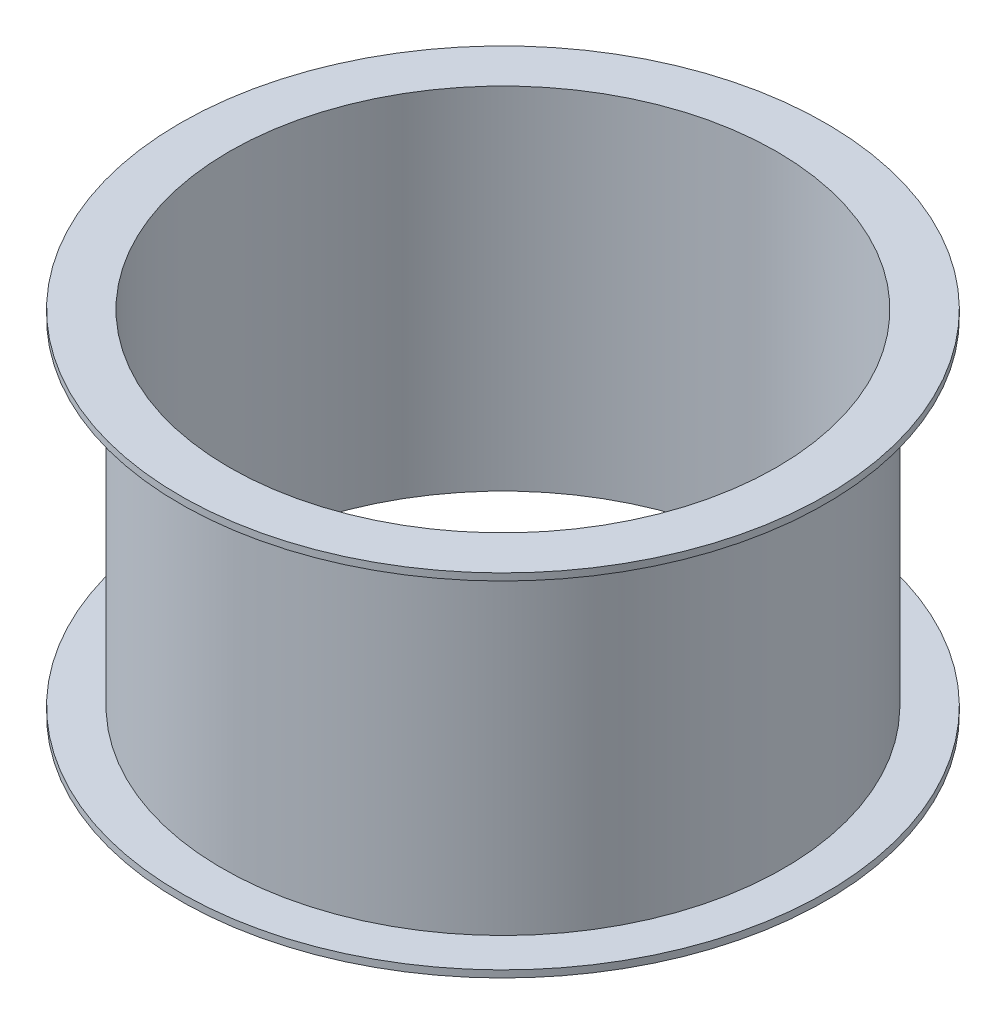
ISO-10303-21;
HEADER;
FILE_DESCRIPTION(('STEP AP214'),'2;1');
FILE_NAME('part.step','',(''),(''),'','','');
FILE_SCHEMA(('AUTOMOTIVE_DESIGN { 1 0 10303 214 1 1 1 1 }'));
ENDSEC;
DATA;
#1=APPLICATION_CONTEXT('core data for automotive mechanical design processes');
#2=APPLICATION_PROTOCOL_DEFINITION('international standard','automotive_design',2000,#1);
#3=PRODUCT_CONTEXT('',#1,'mechanical');
#4=PRODUCT('Part','Part','',(#3));
#5=PRODUCT_RELATED_PRODUCT_CATEGORY('part','',(#4));
#6=PRODUCT_DEFINITION_FORMATION('','',#4);
#7=PRODUCT_DEFINITION_CONTEXT('part definition',#1,'design');
#8=PRODUCT_DEFINITION('design','',#6,#7);
#9=PRODUCT_DEFINITION_SHAPE('','',#8);
#10=(LENGTH_UNIT() NAMED_UNIT(*) SI_UNIT(.MILLI.,.METRE.));
#11=(NAMED_UNIT(*) PLANE_ANGLE_UNIT() SI_UNIT($,.RADIAN.));
#12=(NAMED_UNIT(*) SI_UNIT($,.STERADIAN.) SOLID_ANGLE_UNIT());
#13=UNCERTAINTY_MEASURE_WITH_UNIT(LENGTH_MEASURE(1.E-05),#10,'distance_accuracy_value','');
#14=(GEOMETRIC_REPRESENTATION_CONTEXT(3) GLOBAL_UNCERTAINTY_ASSIGNED_CONTEXT((#13)) GLOBAL_UNIT_ASSIGNED_CONTEXT((#10,
#11,#12)) REPRESENTATION_CONTEXT('',''));
#15=CARTESIAN_POINT('',(0.,0.,0.));
#16=DIRECTION('',(0.,0.,1.));
#17=DIRECTION('',(1.,0.,0.));
#18=AXIS2_PLACEMENT_3D('',#15,#16,#17);
#19=CARTESIAN_POINT('',(-42.5,50.,0.));
#20=DIRECTION('',(0.,1.,0.));
#21=DIRECTION('',(1.,0.,0.));
#22=AXIS2_PLACEMENT_3D('',#19,#20,#21);
#23=PLANE('',#22);
#24=CARTESIAN_POINT('',(0.,50.,0.));
#25=DIRECTION('',(0.,1.,0.));
#26=DIRECTION('',(-1.,0.,0.));
#27=AXIS2_PLACEMENT_3D('',#24,#25,#26);
#28=CIRCLE('',#27,39.);
#29=CARTESIAN_POINT('',(-39.,50.,0.));
#30=VERTEX_POINT('',#29);
#31=EDGE_CURVE('E82',#30,#30,#28,.T.);
#32=ORIENTED_EDGE('',*,*,#31,.F.);
#33=EDGE_LOOP('',(#32));
#34=FACE_BOUND('',#33,.T.);
#35=CARTESIAN_POINT('',(0.,50.,0.));
#36=DIRECTION('',(0.,1.,0.));
#37=DIRECTION('',(-1.,0.,0.));
#38=AXIS2_PLACEMENT_3D('',#35,#36,#37);
#39=CIRCLE('',#38,46.);
#40=CARTESIAN_POINT('',(-46.,50.,0.));
#41=VERTEX_POINT('',#40);
#42=EDGE_CURVE('E10',#41,#41,#39,.T.);
#43=ORIENTED_EDGE('',*,*,#42,.T.);
#44=EDGE_LOOP('',(#43));
#45=FACE_BOUND('',#44,.T.);
#46=ADVANCED_FACE('F16',(#34,#45),#23,.T.);
#47=CARTESIAN_POINT('',(0.,49.5,0.));
#48=DIRECTION('',(0.,1.,0.));
#49=DIRECTION('',(-1.,0.,0.));
#50=AXIS2_PLACEMENT_3D('',#47,#48,#49);
#51=CYLINDRICAL_SURFACE('',#50,46.);
#52=CARTESIAN_POINT('',(0.,49.,0.));
#53=DIRECTION('',(0.,1.,0.));
#54=DIRECTION('',(-1.,0.,0.));
#55=AXIS2_PLACEMENT_3D('',#52,#53,#54);
#56=CIRCLE('',#55,46.);
#57=CARTESIAN_POINT('',(-46.,49.,0.));
#58=VERTEX_POINT('',#57);
#59=EDGE_CURVE('E20',#58,#58,#56,.T.);
#60=ORIENTED_EDGE('',*,*,#59,.T.);
#61=EDGE_LOOP('',(#60));
#62=FACE_BOUND('',#61,.T.);
#63=ORIENTED_EDGE('',*,*,#42,.F.);
#64=EDGE_LOOP('',(#63));
#65=FACE_BOUND('',#64,.T.);
#66=ADVANCED_FACE('F94',(#62,#65),#51,.T.);
#67=CARTESIAN_POINT('',(-43.,49.,0.));
#68=DIRECTION('',(0.,-1.,0.));
#69=DIRECTION('',(0.,0.,-1.));
#70=AXIS2_PLACEMENT_3D('',#67,#68,#69);
#71=PLANE('',#70);
#72=CARTESIAN_POINT('',(0.,49.,0.));
#73=DIRECTION('',(0.,1.,0.));
#74=DIRECTION('',(-1.,0.,0.));
#75=AXIS2_PLACEMENT_3D('',#72,#73,#74);
#76=CIRCLE('',#75,40.);
#77=CARTESIAN_POINT('',(-40.,49.,0.));
#78=VERTEX_POINT('',#77);
#79=EDGE_CURVE('E67',#78,#78,#76,.T.);
#80=ORIENTED_EDGE('',*,*,#79,.T.);
#81=EDGE_LOOP('',(#80));
#82=FACE_BOUND('',#81,.T.);
#83=ORIENTED_EDGE('',*,*,#59,.F.);
#84=EDGE_LOOP('',(#83));
#85=FACE_BOUND('',#84,.T.);
#86=ADVANCED_FACE('F100',(#82,#85),#71,.T.);
#87=CARTESIAN_POINT('',(0.,25.,0.));
#88=DIRECTION('',(0.,1.,0.));
#89=DIRECTION('',(-1.,0.,0.));
#90=AXIS2_PLACEMENT_3D('',#87,#88,#89);
#91=CYLINDRICAL_SURFACE('',#90,40.);
#92=CARTESIAN_POINT('',(0.,0.999999999999943,0.));
#93=DIRECTION('',(0.,1.,0.));
#94=DIRECTION('',(-1.,0.,0.));
#95=AXIS2_PLACEMENT_3D('',#92,#93,#94);
#96=CIRCLE('',#95,40.);
#97=CARTESIAN_POINT('',(-40.,0.999999999999941,0.));
#98=VERTEX_POINT('',#97);
#99=EDGE_CURVE('E62',#98,#98,#96,.T.);
#100=ORIENTED_EDGE('',*,*,#99,.T.);
#101=EDGE_LOOP('',(#100));
#102=FACE_BOUND('',#101,.T.);
#103=ORIENTED_EDGE('',*,*,#79,.F.);
#104=EDGE_LOOP('',(#103));
#105=FACE_BOUND('',#104,.T.);
#106=ADVANCED_FACE('F63',(#102,#105),#91,.T.);
#107=CARTESIAN_POINT('',(-43.,0.99999999999994,0.));
#108=DIRECTION('',(0.,1.,0.));
#109=DIRECTION('',(1.,0.,0.));
#110=AXIS2_PLACEMENT_3D('',#107,#108,#109);
#111=PLANE('',#110);
#112=ORIENTED_EDGE('',*,*,#99,.F.);
#113=EDGE_LOOP('',(#112));
#114=FACE_BOUND('',#113,.T.);
#115=CARTESIAN_POINT('',(0.,0.999999999999943,0.));
#116=DIRECTION('',(0.,1.,0.));
#117=DIRECTION('',(-1.,0.,0.));
#118=AXIS2_PLACEMENT_3D('',#115,#116,#117);
#119=CIRCLE('',#118,46.);
#120=CARTESIAN_POINT('',(-46.,0.99999999999994,0.));
#121=VERTEX_POINT('',#120);
#122=EDGE_CURVE('E68',#121,#121,#119,.T.);
#123=ORIENTED_EDGE('',*,*,#122,.T.);
#124=EDGE_LOOP('',(#123));
#125=FACE_BOUND('',#124,.T.);
#126=ADVANCED_FACE('F114',(#114,#125),#111,.T.);
#127=CARTESIAN_POINT('',(0.,0.499999999999972,0.));
#128=DIRECTION('',(0.,1.,0.));
#129=DIRECTION('',(-1.,0.,0.));
#130=AXIS2_PLACEMENT_3D('',#127,#128,#129);
#131=CYLINDRICAL_SURFACE('',#130,46.);
#132=CARTESIAN_POINT('',(0.,0.,0.));
#133=DIRECTION('',(0.,1.,0.));
#134=DIRECTION('',(-1.,0.,0.));
#135=AXIS2_PLACEMENT_3D('',#132,#133,#134);
#136=CIRCLE('',#135,46.);
#137=CARTESIAN_POINT('',(-46.,0.,0.));
#138=VERTEX_POINT('',#137);
#139=EDGE_CURVE('E76',#138,#138,#136,.T.);
#140=ORIENTED_EDGE('',*,*,#139,.T.);
#141=EDGE_LOOP('',(#140));
#142=FACE_BOUND('',#141,.T.);
#143=ORIENTED_EDGE('',*,*,#122,.F.);
#144=EDGE_LOOP('',(#143));
#145=FACE_BOUND('',#144,.T.);
#146=ADVANCED_FACE('F18',(#142,#145),#131,.T.);
#147=CARTESIAN_POINT('',(-42.5,0.,0.));
#148=DIRECTION('',(0.,-1.,0.));
#149=DIRECTION('',(0.,0.,-1.));
#150=AXIS2_PLACEMENT_3D('',#147,#148,#149);
#151=PLANE('',#150);
#152=CARTESIAN_POINT('',(0.,0.,0.));
#153=DIRECTION('',(0.,1.,0.));
#154=DIRECTION('',(-1.,0.,0.));
#155=AXIS2_PLACEMENT_3D('',#152,#153,#154);
#156=CIRCLE('',#155,39.);
#157=CARTESIAN_POINT('',(-39.,0.,0.));
#158=VERTEX_POINT('',#157);
#159=EDGE_CURVE('E79',#158,#158,#156,.T.);
#160=ORIENTED_EDGE('',*,*,#159,.T.);
#161=EDGE_LOOP('',(#160));
#162=FACE_BOUND('',#161,.T.);
#163=ORIENTED_EDGE('',*,*,#139,.F.);
#164=EDGE_LOOP('',(#163));
#165=FACE_BOUND('',#164,.T.);
#166=ADVANCED_FACE('F104',(#162,#165),#151,.T.);
#167=CARTESIAN_POINT('',(0.,25.,0.));
#168=DIRECTION('',(0.,1.,0.));
#169=DIRECTION('',(-1.,0.,0.));
#170=AXIS2_PLACEMENT_3D('',#167,#168,#169);
#171=CYLINDRICAL_SURFACE('',#170,39.);
#172=ORIENTED_EDGE('',*,*,#31,.T.);
#173=EDGE_LOOP('',(#172));
#174=FACE_BOUND('',#173,.T.);
#175=ORIENTED_EDGE('',*,*,#159,.F.);
#176=EDGE_LOOP('',(#175));
#177=FACE_BOUND('',#176,.T.);
#178=ADVANCED_FACE('F90',(#174,#177),#171,.F.);
#179=CLOSED_SHELL('',(#46,#66,#86,#106,#126,#146,#166,#178));
#180=MANIFOLD_SOLID_BREP('B1',#179);
#181=ADVANCED_BREP_SHAPE_REPRESENTATION('',(#18,#180),#14);
#182=SHAPE_DEFINITION_REPRESENTATION(#9,#181);
ENDSEC;
END-ISO-10303-21;
